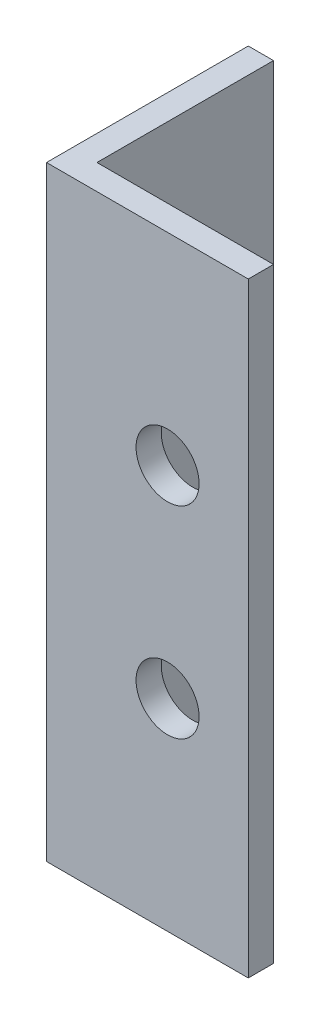
ISO-10303-21;
HEADER;
FILE_DESCRIPTION(('STEP AP214'),'2;1');
FILE_NAME('part.step','',(''),(''),'','','');
FILE_SCHEMA(('AUTOMOTIVE_DESIGN { 1 0 10303 214 1 1 1 1 }'));
ENDSEC;
DATA;
#1=APPLICATION_CONTEXT('core data for automotive mechanical design processes');
#2=APPLICATION_PROTOCOL_DEFINITION('international standard','automotive_design',2000,#1);
#3=PRODUCT_CONTEXT('',#1,'mechanical');
#4=PRODUCT('Part','Part','',(#3));
#5=PRODUCT_RELATED_PRODUCT_CATEGORY('part','',(#4));
#6=PRODUCT_DEFINITION_FORMATION('','',#4);
#7=PRODUCT_DEFINITION_CONTEXT('part definition',#1,'design');
#8=PRODUCT_DEFINITION('design','',#6,#7);
#9=PRODUCT_DEFINITION_SHAPE('','',#8);
#10=(LENGTH_UNIT() NAMED_UNIT(*) SI_UNIT(.MILLI.,.METRE.));
#11=(NAMED_UNIT(*) PLANE_ANGLE_UNIT() SI_UNIT($,.RADIAN.));
#12=(NAMED_UNIT(*) SI_UNIT($,.STERADIAN.) SOLID_ANGLE_UNIT());
#13=UNCERTAINTY_MEASURE_WITH_UNIT(LENGTH_MEASURE(1.E-05),#10,'distance_accuracy_value','');
#14=(GEOMETRIC_REPRESENTATION_CONTEXT(3) GLOBAL_UNCERTAINTY_ASSIGNED_CONTEXT((#13)) GLOBAL_UNIT_ASSIGNED_CONTEXT((#10,
#11,#12)) REPRESENTATION_CONTEXT('',''));
#15=CARTESIAN_POINT('',(0.,0.,0.));
#16=DIRECTION('',(0.,0.,1.));
#17=DIRECTION('',(1.,0.,0.));
#18=AXIS2_PLACEMENT_3D('',#15,#16,#17);
#19=CARTESIAN_POINT('',(0.,76.2,0.));
#20=DIRECTION('',(1.,0.,0.));
#21=DIRECTION('',(0.,0.,-1.));
#22=AXIS2_PLACEMENT_3D('',#19,#20,#21);
#23=PLANE('',#22);
#24=DIRECTION('',(0.,0.,1.));
#25=VECTOR('',#24,1.);
#26=CARTESIAN_POINT('',(0.,0.,0.));
#27=LINE('',#26,#25);
#28=CARTESIAN_POINT('',(0.,0.,-25.4));
#29=VERTEX_POINT('',#28);
#30=CARTESIAN_POINT('',(0.,0.,0.));
#31=VERTEX_POINT('',#30);
#32=EDGE_CURVE('E116',#29,#31,#27,.T.);
#33=ORIENTED_EDGE('',*,*,#32,.T.);
#34=DIRECTION('',(0.,-1.,0.));
#35=VECTOR('',#34,1.);
#36=CARTESIAN_POINT('',(0.,76.2,0.));
#37=LINE('',#36,#35);
#38=CARTESIAN_POINT('',(0.,76.2,0.));
#39=VERTEX_POINT('',#38);
#40=EDGE_CURVE('E11',#39,#31,#37,.T.);
#41=ORIENTED_EDGE('',*,*,#40,.F.);
#42=DIRECTION('',(0.,0.,1.));
#43=VECTOR('',#42,1.);
#44=CARTESIAN_POINT('',(0.,76.2,0.));
#45=LINE('',#44,#43);
#46=CARTESIAN_POINT('',(0.,76.2,-25.4));
#47=VERTEX_POINT('',#46);
#48=EDGE_CURVE('E127',#47,#39,#45,.T.);
#49=ORIENTED_EDGE('',*,*,#48,.F.);
#50=DIRECTION('',(0.,-1.,0.));
#51=VECTOR('',#50,1.);
#52=CARTESIAN_POINT('',(0.,76.2,-25.4));
#53=LINE('',#52,#51);
#54=EDGE_CURVE('E112',#47,#29,#53,.T.);
#55=ORIENTED_EDGE('',*,*,#54,.T.);
#56=EDGE_LOOP('',(#33,#41,#49,#55));
#57=FACE_BOUND('',#56,.T.);
#58=ADVANCED_FACE('F32',(#57),#23,.F.);
#59=CARTESIAN_POINT('',(0.,76.2,0.));
#60=DIRECTION('',(0.,0.,-1.));
#61=DIRECTION('',(-1.,0.,0.));
#62=AXIS2_PLACEMENT_3D('',#59,#60,#61);
#63=PLANE('',#62);
#64=CARTESIAN_POINT('',(15.24,50.8,0.));
#65=DIRECTION('',(0.,0.,1.));
#66=DIRECTION('',(1.,0.,0.));
#67=AXIS2_PLACEMENT_3D('',#64,#65,#66);
#68=CIRCLE('',#67,3.96875);
#69=CARTESIAN_POINT('',(19.20875,50.8,0.));
#70=VERTEX_POINT('',#69);
#71=EDGE_CURVE('E184',#70,#70,#68,.T.);
#72=ORIENTED_EDGE('',*,*,#71,.F.);
#73=EDGE_LOOP('',(#72));
#74=FACE_BOUND('',#73,.T.);
#75=CARTESIAN_POINT('',(15.24,25.4,0.));
#76=DIRECTION('',(0.,0.,1.));
#77=DIRECTION('',(1.,0.,0.));
#78=AXIS2_PLACEMENT_3D('',#75,#76,#77);
#79=CIRCLE('',#78,3.96875);
#80=CARTESIAN_POINT('',(19.20875,25.4,0.));
#81=VERTEX_POINT('',#80);
#82=EDGE_CURVE('E176',#81,#81,#79,.T.);
#83=ORIENTED_EDGE('',*,*,#82,.F.);
#84=EDGE_LOOP('',(#83));
#85=FACE_BOUND('',#84,.T.);
#86=DIRECTION('',(1.,0.,0.));
#87=VECTOR('',#86,1.);
#88=CARTESIAN_POINT('',(0.,0.,0.));
#89=LINE('',#88,#87);
#90=CARTESIAN_POINT('',(25.4,0.,0.));
#91=VERTEX_POINT('',#90);
#92=EDGE_CURVE('E119',#31,#91,#89,.T.);
#93=ORIENTED_EDGE('',*,*,#92,.T.);
#94=DIRECTION('',(0.,-1.,0.));
#95=VECTOR('',#94,1.);
#96=CARTESIAN_POINT('',(25.4,76.2,0.));
#97=LINE('',#96,#95);
#98=CARTESIAN_POINT('',(25.4,76.2,0.));
#99=VERTEX_POINT('',#98);
#100=EDGE_CURVE('E40',#99,#91,#97,.T.);
#101=ORIENTED_EDGE('',*,*,#100,.F.);
#102=DIRECTION('',(1.,0.,0.));
#103=VECTOR('',#102,1.);
#104=CARTESIAN_POINT('',(0.,76.2,0.));
#105=LINE('',#104,#103);
#106=EDGE_CURVE('E85',#39,#99,#105,.T.);
#107=ORIENTED_EDGE('',*,*,#106,.F.);
#108=ORIENTED_EDGE('',*,*,#40,.T.);
#109=EDGE_LOOP('',(#93,#101,#107,#108));
#110=FACE_BOUND('',#109,.T.);
#111=ADVANCED_FACE('F151',(#74,#85,#110),#63,.F.);
#112=CARTESIAN_POINT('',(25.4,76.2,0.));
#113=DIRECTION('',(-1.,0.,0.));
#114=DIRECTION('',(0.,0.,1.));
#115=AXIS2_PLACEMENT_3D('',#112,#113,#114);
#116=PLANE('',#115);
#117=DIRECTION('',(0.,0.,-1.));
#118=VECTOR('',#117,1.);
#119=CARTESIAN_POINT('',(25.4,0.,0.));
#120=LINE('',#119,#118);
#121=CARTESIAN_POINT('',(25.4,0.,-3.175));
#122=VERTEX_POINT('',#121);
#123=EDGE_CURVE('E122',#91,#122,#120,.T.);
#124=ORIENTED_EDGE('',*,*,#123,.T.);
#125=DIRECTION('',(0.,-1.,0.));
#126=VECTOR('',#125,1.);
#127=CARTESIAN_POINT('',(25.4,76.2,-3.175));
#128=LINE('',#127,#126);
#129=CARTESIAN_POINT('',(25.4,76.2,-3.175));
#130=VERTEX_POINT('',#129);
#131=EDGE_CURVE('E107',#130,#122,#128,.T.);
#132=ORIENTED_EDGE('',*,*,#131,.F.);
#133=DIRECTION('',(0.,0.,-1.));
#134=VECTOR('',#133,1.);
#135=CARTESIAN_POINT('',(25.4,76.2,0.));
#136=LINE('',#135,#134);
#137=EDGE_CURVE('E98',#99,#130,#136,.T.);
#138=ORIENTED_EDGE('',*,*,#137,.F.);
#139=ORIENTED_EDGE('',*,*,#100,.T.);
#140=EDGE_LOOP('',(#124,#132,#138,#139));
#141=FACE_BOUND('',#140,.T.);
#142=ADVANCED_FACE('F133',(#141),#116,.F.);
#143=CARTESIAN_POINT('',(3.175,76.2,-3.175));
#144=DIRECTION('',(0.,0.,1.));
#145=DIRECTION('',(1.,0.,0.));
#146=AXIS2_PLACEMENT_3D('',#143,#144,#145);
#147=PLANE('',#146);
#148=CARTESIAN_POINT('',(15.24,50.8,-3.175));
#149=DIRECTION('',(0.,0.,1.));
#150=DIRECTION('',(1.,0.,0.));
#151=AXIS2_PLACEMENT_3D('',#148,#149,#150);
#152=CIRCLE('',#151,3.96875);
#153=CARTESIAN_POINT('',(19.20875,50.8,-3.17500000000001));
#154=VERTEX_POINT('',#153);
#155=EDGE_CURVE('E172',#154,#154,#152,.F.);
#156=ORIENTED_EDGE('',*,*,#155,.F.);
#157=EDGE_LOOP('',(#156));
#158=FACE_BOUND('',#157,.T.);
#159=CARTESIAN_POINT('',(15.24,25.4,-3.175));
#160=DIRECTION('',(0.,0.,1.));
#161=DIRECTION('',(1.,0.,0.));
#162=AXIS2_PLACEMENT_3D('',#159,#160,#161);
#163=CIRCLE('',#162,3.96875);
#164=CARTESIAN_POINT('',(19.20875,25.4,-3.17500000000001));
#165=VERTEX_POINT('',#164);
#166=EDGE_CURVE('E120',#165,#165,#163,.F.);
#167=ORIENTED_EDGE('',*,*,#166,.F.);
#168=EDGE_LOOP('',(#167));
#169=FACE_BOUND('',#168,.T.);
#170=DIRECTION('',(-1.,0.,0.));
#171=VECTOR('',#170,1.);
#172=CARTESIAN_POINT('',(3.175,0.,-3.175));
#173=LINE('',#172,#171);
#174=CARTESIAN_POINT('',(3.175,0.,-3.175));
#175=VERTEX_POINT('',#174);
#176=EDGE_CURVE('E106',#122,#175,#173,.T.);
#177=ORIENTED_EDGE('',*,*,#176,.T.);
#178=DIRECTION('',(0.,-1.,0.));
#179=VECTOR('',#178,1.);
#180=CARTESIAN_POINT('',(3.175,76.2,-3.175));
#181=LINE('',#180,#179);
#182=CARTESIAN_POINT('',(3.175,76.2,-3.175));
#183=VERTEX_POINT('',#182);
#184=EDGE_CURVE('E103',#183,#175,#181,.T.);
#185=ORIENTED_EDGE('',*,*,#184,.F.);
#186=DIRECTION('',(-1.,0.,0.));
#187=VECTOR('',#186,1.);
#188=CARTESIAN_POINT('',(3.175,76.2,-3.175));
#189=LINE('',#188,#187);
#190=EDGE_CURVE('E92',#130,#183,#189,.T.);
#191=ORIENTED_EDGE('',*,*,#190,.F.);
#192=ORIENTED_EDGE('',*,*,#131,.T.);
#193=EDGE_LOOP('',(#177,#185,#191,#192));
#194=FACE_BOUND('',#193,.T.);
#195=ADVANCED_FACE('F104',(#158,#169,#194),#147,.F.);
#196=CARTESIAN_POINT('',(3.175,76.2,-25.4));
#197=DIRECTION('',(-1.,0.,0.));
#198=DIRECTION('',(0.,0.,1.));
#199=AXIS2_PLACEMENT_3D('',#196,#197,#198);
#200=PLANE('',#199);
#201=DIRECTION('',(0.,0.,-1.));
#202=VECTOR('',#201,1.);
#203=CARTESIAN_POINT('',(3.175,0.,-25.4));
#204=LINE('',#203,#202);
#205=CARTESIAN_POINT('',(3.175,0.,-25.4));
#206=VERTEX_POINT('',#205);
#207=EDGE_CURVE('E71',#175,#206,#204,.T.);
#208=ORIENTED_EDGE('',*,*,#207,.T.);
#209=DIRECTION('',(0.,-1.,0.));
#210=VECTOR('',#209,1.);
#211=CARTESIAN_POINT('',(3.175,76.2,-25.4));
#212=LINE('',#211,#210);
#213=CARTESIAN_POINT('',(3.175,76.2,-25.4));
#214=VERTEX_POINT('',#213);
#215=EDGE_CURVE('E108',#214,#206,#212,.T.);
#216=ORIENTED_EDGE('',*,*,#215,.F.);
#217=DIRECTION('',(0.,0.,-1.));
#218=VECTOR('',#217,1.);
#219=CARTESIAN_POINT('',(3.175,76.2,-25.4));
#220=LINE('',#219,#218);
#221=EDGE_CURVE('E96',#183,#214,#220,.T.);
#222=ORIENTED_EDGE('',*,*,#221,.F.);
#223=ORIENTED_EDGE('',*,*,#184,.T.);
#224=EDGE_LOOP('',(#208,#216,#222,#223));
#225=FACE_BOUND('',#224,.T.);
#226=ADVANCED_FACE('F110',(#225),#200,.F.);
#227=CARTESIAN_POINT('',(0.,76.2,-25.4));
#228=DIRECTION('',(0.,0.,1.));
#229=DIRECTION('',(1.,0.,0.));
#230=AXIS2_PLACEMENT_3D('',#227,#228,#229);
#231=PLANE('',#230);
#232=DIRECTION('',(-1.,0.,0.));
#233=VECTOR('',#232,1.);
#234=CARTESIAN_POINT('',(0.,0.,-25.4));
#235=LINE('',#234,#233);
#236=EDGE_CURVE('E77',#206,#29,#235,.T.);
#237=ORIENTED_EDGE('',*,*,#236,.T.);
#238=ORIENTED_EDGE('',*,*,#54,.F.);
#239=DIRECTION('',(-1.,0.,0.));
#240=VECTOR('',#239,1.);
#241=CARTESIAN_POINT('',(0.,76.2,-25.4));
#242=LINE('',#241,#240);
#243=EDGE_CURVE('E48',#214,#47,#242,.T.);
#244=ORIENTED_EDGE('',*,*,#243,.F.);
#245=ORIENTED_EDGE('',*,*,#215,.T.);
#246=EDGE_LOOP('',(#237,#238,#244,#245));
#247=FACE_BOUND('',#246,.T.);
#248=ADVANCED_FACE('F140',(#247),#231,.F.);
#249=CARTESIAN_POINT('',(0.,76.2,0.));
#250=DIRECTION('',(0.,-1.,0.));
#251=DIRECTION('',(0.,0.,-1.));
#252=AXIS2_PLACEMENT_3D('',#249,#250,#251);
#253=PLANE('',#252);
#254=ORIENTED_EDGE('',*,*,#48,.T.);
#255=ORIENTED_EDGE('',*,*,#106,.T.);
#256=ORIENTED_EDGE('',*,*,#137,.T.);
#257=ORIENTED_EDGE('',*,*,#190,.T.);
#258=ORIENTED_EDGE('',*,*,#221,.T.);
#259=ORIENTED_EDGE('',*,*,#243,.T.);
#260=EDGE_LOOP('',(#254,#255,#256,#257,#258,#259));
#261=FACE_BOUND('',#260,.T.);
#262=ADVANCED_FACE('F94',(#261),#253,.F.);
#263=CARTESIAN_POINT('',(0.,0.,0.));
#264=DIRECTION('',(0.,-1.,0.));
#265=DIRECTION('',(0.,0.,-1.));
#266=AXIS2_PLACEMENT_3D('',#263,#264,#265);
#267=PLANE('',#266);
#268=ORIENTED_EDGE('',*,*,#32,.F.);
#269=ORIENTED_EDGE('',*,*,#236,.F.);
#270=ORIENTED_EDGE('',*,*,#207,.F.);
#271=ORIENTED_EDGE('',*,*,#176,.F.);
#272=ORIENTED_EDGE('',*,*,#123,.F.);
#273=ORIENTED_EDGE('',*,*,#92,.F.);
#274=EDGE_LOOP('',(#268,#269,#270,#271,#272,#273));
#275=FACE_BOUND('',#274,.T.);
#276=ADVANCED_FACE('F136',(#275),#267,.T.);
#277=CARTESIAN_POINT('',(15.24,25.4,-25.401));
#278=DIRECTION('',(0.,0.,1.));
#279=DIRECTION('',(1.,0.,0.));
#280=AXIS2_PLACEMENT_3D('',#277,#278,#279);
#281=CYLINDRICAL_SURFACE('',#280,3.96875);
#282=CARTESIAN_POINT('',(19.20875,25.4,0.));
#283=CARTESIAN_POINT('',(19.20875,25.4,-0.0330729166666705));
#284=CARTESIAN_POINT('',(19.20875,25.4,-0.0661458333333376));
#285=CARTESIAN_POINT('',(19.20875,25.4,-0.132291666666671));
#286=CARTESIAN_POINT('',(19.20875,25.4,-0.165364583333337));
#287=CARTESIAN_POINT('',(19.20875,25.4,-0.231510416666669));
#288=CARTESIAN_POINT('',(19.20875,25.4,-0.264583333333337));
#289=CARTESIAN_POINT('',(19.20875,25.4,-0.330729166666671));
#290=CARTESIAN_POINT('',(19.20875,25.4,-0.363802083333338));
#291=CARTESIAN_POINT('',(19.20875,25.4,-0.429947916666671));
#292=CARTESIAN_POINT('',(19.20875,25.4,-0.463020833333337));
#293=CARTESIAN_POINT('',(19.20875,25.4,-0.52916666666667));
#294=CARTESIAN_POINT('',(19.20875,25.4,-0.562239583333337));
#295=CARTESIAN_POINT('',(19.20875,25.4,-0.628385416666671));
#296=CARTESIAN_POINT('',(19.20875,25.4,-0.661458333333338));
#297=CARTESIAN_POINT('',(19.20875,25.4,-0.727604166666672));
#298=CARTESIAN_POINT('',(19.20875,25.4,-0.760677083333339));
#299=CARTESIAN_POINT('',(19.20875,25.4,-0.826822916666672));
#300=CARTESIAN_POINT('',(19.20875,25.4,-0.859895833333338));
#301=CARTESIAN_POINT('',(19.20875,25.4,-0.926041666666671));
#302=CARTESIAN_POINT('',(19.20875,25.4,-0.959114583333338));
#303=CARTESIAN_POINT('',(19.20875,25.4,-1.02526041666667));
#304=CARTESIAN_POINT('',(19.20875,25.4,-1.05833333333334));
#305=CARTESIAN_POINT('',(19.20875,25.4,-1.12447916666667));
#306=CARTESIAN_POINT('',(19.20875,25.4,-1.15755208333334));
#307=CARTESIAN_POINT('',(19.20875,25.4,-1.22369791666667));
#308=CARTESIAN_POINT('',(19.20875,25.4,-1.25677083333334));
#309=CARTESIAN_POINT('',(19.20875,25.4,-1.32291666666667));
#310=CARTESIAN_POINT('',(19.20875,25.4,-1.35598958333334));
#311=CARTESIAN_POINT('',(19.20875,25.4,-1.42213541666667));
#312=CARTESIAN_POINT('',(19.20875,25.4,-1.45520833333334));
#313=CARTESIAN_POINT('',(19.20875,25.4,-1.52135416666667));
#314=CARTESIAN_POINT('',(19.20875,25.4,-1.55442708333334));
#315=CARTESIAN_POINT('',(19.20875,25.4,-1.62057291666667));
#316=CARTESIAN_POINT('',(19.20875,25.4,-1.65364583333334));
#317=CARTESIAN_POINT('',(19.20875,25.4,-1.71979166666667));
#318=CARTESIAN_POINT('',(19.20875,25.4,-1.75286458333334));
#319=CARTESIAN_POINT('',(19.20875,25.4,-1.81901041666667));
#320=CARTESIAN_POINT('',(19.20875,25.4,-1.85208333333334));
#321=CARTESIAN_POINT('',(19.20875,25.4,-1.91822916666667));
#322=CARTESIAN_POINT('',(19.20875,25.4,-1.95130208333334));
#323=CARTESIAN_POINT('',(19.20875,25.4,-2.01744791666667));
#324=CARTESIAN_POINT('',(19.20875,25.4,-2.05052083333334));
#325=CARTESIAN_POINT('',(19.20875,25.4,-2.11666666666667));
#326=CARTESIAN_POINT('',(19.20875,25.4,-2.14973958333334));
#327=CARTESIAN_POINT('',(19.20875,25.4,-2.21588541666667));
#328=CARTESIAN_POINT('',(19.20875,25.4,-2.24895833333334));
#329=CARTESIAN_POINT('',(19.20875,25.4,-2.31510416666667));
#330=CARTESIAN_POINT('',(19.20875,25.4,-2.34817708333334));
#331=CARTESIAN_POINT('',(19.20875,25.4,-2.41432291666667));
#332=CARTESIAN_POINT('',(19.20875,25.4,-2.44739583333334));
#333=CARTESIAN_POINT('',(19.20875,25.4,-2.51354166666667));
#334=CARTESIAN_POINT('',(19.20875,25.4,-2.54661458333334));
#335=CARTESIAN_POINT('',(19.20875,25.4,-2.61276041666667));
#336=CARTESIAN_POINT('',(19.20875,25.4,-2.64583333333334));
#337=CARTESIAN_POINT('',(19.20875,25.4,-2.71197916666667));
#338=CARTESIAN_POINT('',(19.20875,25.4,-2.74505208333334));
#339=CARTESIAN_POINT('',(19.20875,25.4,-2.81119791666667));
#340=CARTESIAN_POINT('',(19.20875,25.4,-2.84427083333334));
#341=CARTESIAN_POINT('',(19.20875,25.4,-2.91041666666667));
#342=CARTESIAN_POINT('',(19.20875,25.4,-2.94348958333334));
#343=CARTESIAN_POINT('',(19.20875,25.4,-3.00963541666667));
#344=CARTESIAN_POINT('',(19.20875,25.4,-3.04270833333334));
#345=CARTESIAN_POINT('',(19.20875,25.4,-3.10885416666667));
#346=CARTESIAN_POINT('',(19.20875,25.4,-3.14192708333334));
#347=CARTESIAN_POINT('',(19.20875,25.4,-3.17500000000001));
#348=B_SPLINE_CURVE_WITH_KNOTS('',3,(#282,#283,#284,#285,#286,#287,#288,#289,#290,#291,#292,
#293,#294,#295,#296,#297,#298,#299,#300,#301,#302,#303,#304,#305,#306,#307,#308,#309,#310,#311,
#312,#313,#314,#315,#316,#317,#318,#319,#320,#321,#322,#323,#324,#325,#326,#327,#328,#329,#330,
#331,#332,#333,#334,#335,#336,#337,#338,#339,#340,#341,#342,#343,#344,#345,#346,#347),
.UNSPECIFIED.,.F.,.F.,(4,2,2,2,2,2,2,2,2,2,2,2,2,2,2,2,2,2,2,2,2,2,2,2,2,2,2,2,2,2,2,2,4),(0.,
0.0992187500000012,0.198437499999999,0.29765625,0.396875000000001,0.496093749999999,0.5953125,
0.694531250000002,0.793750000000003,0.892968750000001,0.992187500000002,1.09140625,1.190625,
1.28984375,1.3890625,1.48828125,1.5875,1.68671875,1.7859375,1.88515625,1.984375,2.08359375,
2.1828125,2.28203125,2.38125,2.48046875,2.5796875,2.67890625,2.778125,2.87734375,
2.97656250000001,3.07578125,3.175),.UNSPECIFIED.);
#349=EDGE_CURVE('BSEAM190',#81,#165,#348,.T.);
#350=ORIENTED_EDGE('',*,*,#82,.T.);
#351=ORIENTED_EDGE('',*,*,#166,.T.);
#352=ORIENTED_EDGE('',*,*,#349,.T.);
#353=ORIENTED_EDGE('',*,*,#349,.F.);
#354=EDGE_LOOP('',(#350,#352,#351,#353));
#355=FACE_BOUND('',#354,.T.);
#356=ADVANCED_FACE('F190',(#355),#281,.F.);
#357=CARTESIAN_POINT('',(15.24,50.8,-25.401));
#358=DIRECTION('',(0.,0.,1.));
#359=DIRECTION('',(1.,0.,0.));
#360=AXIS2_PLACEMENT_3D('',#357,#358,#359);
#361=CYLINDRICAL_SURFACE('',#360,3.96875);
#362=CARTESIAN_POINT('',(19.20875,50.8,0.));
#363=CARTESIAN_POINT('',(19.20875,50.8,-0.0330729166666705));
#364=CARTESIAN_POINT('',(19.20875,50.8,-0.0661458333333376));
#365=CARTESIAN_POINT('',(19.20875,50.8,-0.132291666666671));
#366=CARTESIAN_POINT('',(19.20875,50.8,-0.165364583333337));
#367=CARTESIAN_POINT('',(19.20875,50.8,-0.231510416666669));
#368=CARTESIAN_POINT('',(19.20875,50.8,-0.264583333333337));
#369=CARTESIAN_POINT('',(19.20875,50.8,-0.330729166666671));
#370=CARTESIAN_POINT('',(19.20875,50.8,-0.363802083333338));
#371=CARTESIAN_POINT('',(19.20875,50.8,-0.429947916666671));
#372=CARTESIAN_POINT('',(19.20875,50.8,-0.463020833333337));
#373=CARTESIAN_POINT('',(19.20875,50.8,-0.52916666666667));
#374=CARTESIAN_POINT('',(19.20875,50.8,-0.562239583333337));
#375=CARTESIAN_POINT('',(19.20875,50.8,-0.628385416666671));
#376=CARTESIAN_POINT('',(19.20875,50.8,-0.661458333333338));
#377=CARTESIAN_POINT('',(19.20875,50.8,-0.727604166666672));
#378=CARTESIAN_POINT('',(19.20875,50.8,-0.760677083333339));
#379=CARTESIAN_POINT('',(19.20875,50.8,-0.826822916666672));
#380=CARTESIAN_POINT('',(19.20875,50.8,-0.859895833333338));
#381=CARTESIAN_POINT('',(19.20875,50.8,-0.926041666666671));
#382=CARTESIAN_POINT('',(19.20875,50.8,-0.959114583333338));
#383=CARTESIAN_POINT('',(19.20875,50.8,-1.02526041666667));
#384=CARTESIAN_POINT('',(19.20875,50.8,-1.05833333333334));
#385=CARTESIAN_POINT('',(19.20875,50.8,-1.12447916666667));
#386=CARTESIAN_POINT('',(19.20875,50.8,-1.15755208333334));
#387=CARTESIAN_POINT('',(19.20875,50.8,-1.22369791666667));
#388=CARTESIAN_POINT('',(19.20875,50.8,-1.25677083333334));
#389=CARTESIAN_POINT('',(19.20875,50.8,-1.32291666666667));
#390=CARTESIAN_POINT('',(19.20875,50.8,-1.35598958333334));
#391=CARTESIAN_POINT('',(19.20875,50.8,-1.42213541666667));
#392=CARTESIAN_POINT('',(19.20875,50.8,-1.45520833333334));
#393=CARTESIAN_POINT('',(19.20875,50.8,-1.52135416666667));
#394=CARTESIAN_POINT('',(19.20875,50.8,-1.55442708333334));
#395=CARTESIAN_POINT('',(19.20875,50.8,-1.62057291666667));
#396=CARTESIAN_POINT('',(19.20875,50.8,-1.65364583333334));
#397=CARTESIAN_POINT('',(19.20875,50.8,-1.71979166666667));
#398=CARTESIAN_POINT('',(19.20875,50.8,-1.75286458333334));
#399=CARTESIAN_POINT('',(19.20875,50.8,-1.81901041666667));
#400=CARTESIAN_POINT('',(19.20875,50.8,-1.85208333333334));
#401=CARTESIAN_POINT('',(19.20875,50.8,-1.91822916666667));
#402=CARTESIAN_POINT('',(19.20875,50.8,-1.95130208333334));
#403=CARTESIAN_POINT('',(19.20875,50.8,-2.01744791666667));
#404=CARTESIAN_POINT('',(19.20875,50.8,-2.05052083333334));
#405=CARTESIAN_POINT('',(19.20875,50.8,-2.11666666666667));
#406=CARTESIAN_POINT('',(19.20875,50.8,-2.14973958333334));
#407=CARTESIAN_POINT('',(19.20875,50.8,-2.21588541666667));
#408=CARTESIAN_POINT('',(19.20875,50.8,-2.24895833333334));
#409=CARTESIAN_POINT('',(19.20875,50.8,-2.31510416666667));
#410=CARTESIAN_POINT('',(19.20875,50.8,-2.34817708333334));
#411=CARTESIAN_POINT('',(19.20875,50.8,-2.41432291666667));
#412=CARTESIAN_POINT('',(19.20875,50.8,-2.44739583333334));
#413=CARTESIAN_POINT('',(19.20875,50.8,-2.51354166666667));
#414=CARTESIAN_POINT('',(19.20875,50.8,-2.54661458333334));
#415=CARTESIAN_POINT('',(19.20875,50.8,-2.61276041666667));
#416=CARTESIAN_POINT('',(19.20875,50.8,-2.64583333333334));
#417=CARTESIAN_POINT('',(19.20875,50.8,-2.71197916666667));
#418=CARTESIAN_POINT('',(19.20875,50.8,-2.74505208333334));
#419=CARTESIAN_POINT('',(19.20875,50.8,-2.81119791666667));
#420=CARTESIAN_POINT('',(19.20875,50.8,-2.84427083333334));
#421=CARTESIAN_POINT('',(19.20875,50.8,-2.91041666666667));
#422=CARTESIAN_POINT('',(19.20875,50.8,-2.94348958333334));
#423=CARTESIAN_POINT('',(19.20875,50.8,-3.00963541666667));
#424=CARTESIAN_POINT('',(19.20875,50.8,-3.04270833333334));
#425=CARTESIAN_POINT('',(19.20875,50.8,-3.10885416666667));
#426=CARTESIAN_POINT('',(19.20875,50.8,-3.14192708333334));
#427=CARTESIAN_POINT('',(19.20875,50.8,-3.17500000000001));
#428=B_SPLINE_CURVE_WITH_KNOTS('',3,(#362,#363,#364,#365,#366,#367,#368,#369,#370,#371,#372,
#373,#374,#375,#376,#377,#378,#379,#380,#381,#382,#383,#384,#385,#386,#387,#388,#389,#390,#391,
#392,#393,#394,#395,#396,#397,#398,#399,#400,#401,#402,#403,#404,#405,#406,#407,#408,#409,#410,
#411,#412,#413,#414,#415,#416,#417,#418,#419,#420,#421,#422,#423,#424,#425,#426,#427),
.UNSPECIFIED.,.F.,.F.,(4,2,2,2,2,2,2,2,2,2,2,2,2,2,2,2,2,2,2,2,2,2,2,2,2,2,2,2,2,2,2,2,4),(0.,
0.0992187500000012,0.198437499999999,0.29765625,0.396875000000001,0.496093749999999,0.5953125,
0.694531250000002,0.793750000000003,0.892968750000001,0.992187500000002,1.09140625,1.190625,
1.28984375,1.3890625,1.48828125,1.5875,1.68671875,1.7859375,1.88515625,1.984375,2.08359375,
2.1828125,2.28203125,2.38125,2.48046875,2.5796875,2.67890625,2.778125,2.87734375,
2.97656250000001,3.07578125,3.175),.UNSPECIFIED.);
#429=EDGE_CURVE('BSEAM187',#70,#154,#428,.T.);
#430=ORIENTED_EDGE('',*,*,#71,.T.);
#431=ORIENTED_EDGE('',*,*,#155,.T.);
#432=ORIENTED_EDGE('',*,*,#429,.T.);
#433=ORIENTED_EDGE('',*,*,#429,.F.);
#434=EDGE_LOOP('',(#430,#432,#431,#433));
#435=FACE_BOUND('',#434,.T.);
#436=ADVANCED_FACE('F187',(#435),#361,.F.);
#437=CLOSED_SHELL('',(#58,#111,#142,#195,#226,#248,#262,#276,#356,#436));
#438=MANIFOLD_SOLID_BREP('B2',#437);
#439=ADVANCED_BREP_SHAPE_REPRESENTATION('',(#18,#438),#14);
#440=SHAPE_DEFINITION_REPRESENTATION(#9,#439);
ENDSEC;
END-ISO-10303-21;
